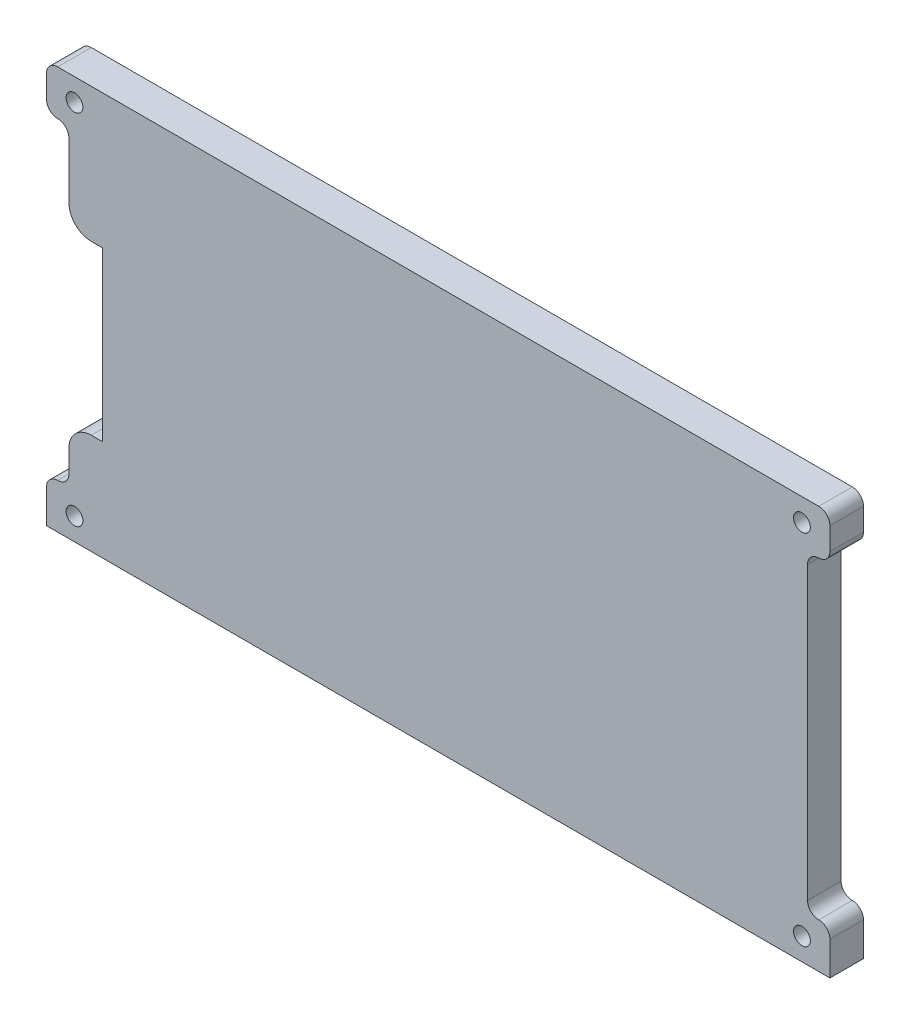
ISO-10303-21;
HEADER;
FILE_DESCRIPTION(('STEP AP214'),'2;1');
FILE_NAME('part.step','',(''),(''),'','','');
FILE_SCHEMA(('AUTOMOTIVE_DESIGN { 1 0 10303 214 1 1 1 1 }'));
ENDSEC;
DATA;
#1=APPLICATION_CONTEXT('core data for automotive mechanical design processes');
#2=APPLICATION_PROTOCOL_DEFINITION('international standard','automotive_design',2000,#1);
#3=PRODUCT_CONTEXT('',#1,'mechanical');
#4=PRODUCT('Part','Part','',(#3));
#5=PRODUCT_RELATED_PRODUCT_CATEGORY('part','',(#4));
#6=PRODUCT_DEFINITION_FORMATION('','',#4);
#7=PRODUCT_DEFINITION_CONTEXT('part definition',#1,'design');
#8=PRODUCT_DEFINITION('design','',#6,#7);
#9=PRODUCT_DEFINITION_SHAPE('','',#8);
#10=(LENGTH_UNIT() NAMED_UNIT(*) SI_UNIT(.MILLI.,.METRE.));
#11=(NAMED_UNIT(*) PLANE_ANGLE_UNIT() SI_UNIT($,.RADIAN.));
#12=(NAMED_UNIT(*) SI_UNIT($,.STERADIAN.) SOLID_ANGLE_UNIT());
#13=UNCERTAINTY_MEASURE_WITH_UNIT(LENGTH_MEASURE(1.E-05),#10,'distance_accuracy_value','');
#14=(GEOMETRIC_REPRESENTATION_CONTEXT(3) GLOBAL_UNCERTAINTY_ASSIGNED_CONTEXT((#13)) GLOBAL_UNIT_ASSIGNED_CONTEXT((#10,
#11,#12)) REPRESENTATION_CONTEXT('',''));
#15=CARTESIAN_POINT('',(0.,0.,0.));
#16=DIRECTION('',(0.,0.,1.));
#17=DIRECTION('',(1.,0.,0.));
#18=AXIS2_PLACEMENT_3D('',#15,#16,#17);
#19=CARTESIAN_POINT('',(-33.,-18.,3.));
#20=DIRECTION('',(1.,0.,0.));
#21=DIRECTION('',(0.,0.,-1.));
#22=AXIS2_PLACEMENT_3D('',#19,#20,#21);
#23=PLANE('',#22);
#24=DIRECTION('',(0.,-1.,0.));
#25=VECTOR('',#24,1.);
#26=CARTESIAN_POINT('',(-33.,-18.,3.));
#27=LINE('',#26,#25);
#28=CARTESIAN_POINT('',(-33.,13.,3.));
#29=VERTEX_POINT('',#28);
#30=CARTESIAN_POINT('',(-33.,8.,3.));
#31=VERTEX_POINT('',#30);
#32=EDGE_CURVE('E328',#29,#31,#27,.T.);
#33=ORIENTED_EDGE('',*,*,#32,.F.);
#34=DIRECTION('',(0.,0.,1.));
#35=VECTOR('',#34,1.);
#36=CARTESIAN_POINT('',(-33.,13.,3.));
#37=LINE('',#36,#35);
#38=CARTESIAN_POINT('',(-33.,13.,0.));
#39=VERTEX_POINT('',#38);
#40=EDGE_CURVE('E439',#29,#39,#37,.F.);
#41=ORIENTED_EDGE('',*,*,#40,.T.);
#42=DIRECTION('',(0.,-1.,0.));
#43=VECTOR('',#42,1.);
#44=CARTESIAN_POINT('',(-33.,-18.,0.));
#45=LINE('',#44,#43);
#46=CARTESIAN_POINT('',(-33.,8.,0.));
#47=VERTEX_POINT('',#46);
#48=EDGE_CURVE('E343',#39,#47,#45,.T.);
#49=ORIENTED_EDGE('',*,*,#48,.T.);
#50=DIRECTION('',(0.,0.,1.));
#51=VECTOR('',#50,1.);
#52=CARTESIAN_POINT('',(-33.,8.,3.));
#53=LINE('',#52,#51);
#54=EDGE_CURVE('E334',#47,#31,#53,.T.);
#55=ORIENTED_EDGE('',*,*,#54,.T.);
#56=EDGE_LOOP('',(#33,#41,#49,#55));
#57=FACE_BOUND('',#56,.T.);
#58=ADVANCED_FACE('F39',(#57),#23,.F.);
#59=CARTESIAN_POINT('',(-33.,-11.,0.));
#60=VERTEX_POINT('',#59);
#61=CARTESIAN_POINT('',(-33.,-13.,0.));
#62=VERTEX_POINT('',#61);
#63=EDGE_CURVE('E342',#60,#62,#45,.T.);
#64=ORIENTED_EDGE('',*,*,#63,.T.);
#65=DIRECTION('',(0.,0.,1.));
#66=VECTOR('',#65,1.);
#67=CARTESIAN_POINT('',(-33.,-13.,3.));
#68=LINE('',#67,#66);
#69=CARTESIAN_POINT('',(-33.,-13.,3.));
#70=VERTEX_POINT('',#69);
#71=EDGE_CURVE('E442',#62,#70,#68,.T.);
#72=ORIENTED_EDGE('',*,*,#71,.T.);
#73=CARTESIAN_POINT('',(-33.,-11.,3.));
#74=VERTEX_POINT('',#73);
#75=EDGE_CURVE('E327',#74,#70,#27,.T.);
#76=ORIENTED_EDGE('',*,*,#75,.F.);
#77=DIRECTION('',(0.,0.,1.));
#78=VECTOR('',#77,1.);
#79=CARTESIAN_POINT('',(-33.,-11.,3.));
#80=LINE('',#79,#78);
#81=EDGE_CURVE('E369',#74,#60,#80,.F.);
#82=ORIENTED_EDGE('',*,*,#81,.T.);
#83=EDGE_LOOP('',(#64,#72,#76,#82));
#84=FACE_BOUND('',#83,.T.);
#85=ADVANCED_FACE('F574',(#84),#23,.F.);
#86=CARTESIAN_POINT('',(33.,-18.,3.));
#87=DIRECTION('',(-1.,0.,0.));
#88=DIRECTION('',(0.,0.,1.));
#89=AXIS2_PLACEMENT_3D('',#86,#87,#88);
#90=PLANE('',#89);
#91=DIRECTION('',(0.,1.,0.));
#92=VECTOR('',#91,1.);
#93=CARTESIAN_POINT('',(33.,-18.,3.));
#94=LINE('',#93,#92);
#95=CARTESIAN_POINT('',(33.,-13.,3.));
#96=VERTEX_POINT('',#95);
#97=CARTESIAN_POINT('',(33.,13.,3.));
#98=VERTEX_POINT('',#97);
#99=EDGE_CURVE('E318',#96,#98,#94,.T.);
#100=ORIENTED_EDGE('',*,*,#99,.F.);
#101=DIRECTION('',(0.,0.,1.));
#102=VECTOR('',#101,1.);
#103=CARTESIAN_POINT('',(33.,-13.,3.));
#104=LINE('',#103,#102);
#105=CARTESIAN_POINT('',(33.,-13.,0.));
#106=VERTEX_POINT('',#105);
#107=EDGE_CURVE('E415',#96,#106,#104,.F.);
#108=ORIENTED_EDGE('',*,*,#107,.T.);
#109=DIRECTION('',(0.,1.,0.));
#110=VECTOR('',#109,1.);
#111=CARTESIAN_POINT('',(33.,-18.,0.));
#112=LINE('',#111,#110);
#113=CARTESIAN_POINT('',(33.,13.,0.));
#114=VERTEX_POINT('',#113);
#115=EDGE_CURVE('E314',#106,#114,#112,.T.);
#116=ORIENTED_EDGE('',*,*,#115,.T.);
#117=DIRECTION('',(0.,0.,1.));
#118=VECTOR('',#117,1.);
#119=CARTESIAN_POINT('',(33.,13.,3.));
#120=LINE('',#119,#118);
#121=EDGE_CURVE('E411',#114,#98,#120,.T.);
#122=ORIENTED_EDGE('',*,*,#121,.T.);
#123=EDGE_LOOP('',(#100,#108,#116,#122));
#124=FACE_BOUND('',#123,.T.);
#125=ADVANCED_FACE('F517',(#124),#90,.F.);
#126=CARTESIAN_POINT('',(-33.,18.,3.));
#127=DIRECTION('',(0.,-1.,0.));
#128=DIRECTION('',(0.,0.,-1.));
#129=AXIS2_PLACEMENT_3D('',#126,#127,#128);
#130=PLANE('',#129);
#131=DIRECTION('',(-1.,0.,0.));
#132=VECTOR('',#131,1.);
#133=CARTESIAN_POINT('',(-33.,18.,3.));
#134=LINE('',#133,#132);
#135=CARTESIAN_POINT('',(34.,18.,3.));
#136=VERTEX_POINT('',#135);
#137=CARTESIAN_POINT('',(-34.,18.,3.));
#138=VERTEX_POINT('',#137);
#139=EDGE_CURVE('E322',#136,#138,#134,.T.);
#140=ORIENTED_EDGE('',*,*,#139,.F.);
#141=DIRECTION('',(0.,0.,1.));
#142=VECTOR('',#141,1.);
#143=CARTESIAN_POINT('',(34.,18.,0.));
#144=LINE('',#143,#142);
#145=CARTESIAN_POINT('',(34.,18.,0.));
#146=VERTEX_POINT('',#145);
#147=EDGE_CURVE('E429',#136,#146,#144,.F.);
#148=ORIENTED_EDGE('',*,*,#147,.T.);
#149=DIRECTION('',(-1.,0.,0.));
#150=VECTOR('',#149,1.);
#151=CARTESIAN_POINT('',(-33.,18.,0.));
#152=LINE('',#151,#150);
#153=CARTESIAN_POINT('',(-34.,18.,0.));
#154=VERTEX_POINT('',#153);
#155=EDGE_CURVE('E338',#146,#154,#152,.T.);
#156=ORIENTED_EDGE('',*,*,#155,.T.);
#157=DIRECTION('',(0.,0.,1.));
#158=VECTOR('',#157,1.);
#159=CARTESIAN_POINT('',(-34.,18.,3.));
#160=LINE('',#159,#158);
#161=EDGE_CURVE('E425',#154,#138,#160,.T.);
#162=ORIENTED_EDGE('',*,*,#161,.T.);
#163=EDGE_LOOP('',(#140,#148,#156,#162));
#164=FACE_BOUND('',#163,.T.);
#165=ADVANCED_FACE('F540',(#164),#130,.F.);
#166=CARTESIAN_POINT('',(-33.,-18.,3.));
#167=DIRECTION('',(0.,1.,0.));
#168=DIRECTION('',(0.,0.,1.));
#169=AXIS2_PLACEMENT_3D('',#166,#167,#168);
#170=PLANE('',#169);
#171=DIRECTION('',(1.,0.,0.));
#172=VECTOR('',#171,1.);
#173=CARTESIAN_POINT('',(-33.,-18.,0.));
#174=LINE('',#173,#172);
#175=CARTESIAN_POINT('',(-35.,-18.,0.));
#176=VERTEX_POINT('',#175);
#177=CARTESIAN_POINT('',(35.,-18.,0.));
#178=VERTEX_POINT('',#177);
#179=EDGE_CURVE('E323',#176,#178,#174,.T.);
#180=ORIENTED_EDGE('',*,*,#179,.T.);
#181=DIRECTION('',(0.,0.,1.));
#182=VECTOR('',#181,1.);
#183=CARTESIAN_POINT('',(35.,-18.,0.));
#184=LINE('',#183,#182);
#185=CARTESIAN_POINT('',(35.,-18.,3.));
#186=VERTEX_POINT('',#185);
#187=EDGE_CURVE('E284',#178,#186,#184,.T.);
#188=ORIENTED_EDGE('',*,*,#187,.T.);
#189=DIRECTION('',(1.,0.,0.));
#190=VECTOR('',#189,1.);
#191=CARTESIAN_POINT('',(-33.,-18.,3.));
#192=LINE('',#191,#190);
#193=CARTESIAN_POINT('',(-35.,-18.,3.));
#194=VERTEX_POINT('',#193);
#195=EDGE_CURVE('E331',#194,#186,#192,.T.);
#196=ORIENTED_EDGE('',*,*,#195,.F.);
#197=DIRECTION('',(0.,0.,1.));
#198=VECTOR('',#197,1.);
#199=CARTESIAN_POINT('',(-35.,-18.,0.));
#200=LINE('',#199,#198);
#201=EDGE_CURVE('E303',#176,#194,#200,.T.);
#202=ORIENTED_EDGE('',*,*,#201,.F.);
#203=EDGE_LOOP('',(#180,#188,#196,#202));
#204=FACE_BOUND('',#203,.T.);
#205=ADVANCED_FACE('F499',(#204),#170,.F.);
#206=CARTESIAN_POINT('',(0.,0.,3.));
#207=DIRECTION('',(0.,0.,-1.));
#208=DIRECTION('',(-1.,0.,0.));
#209=AXIS2_PLACEMENT_3D('',#206,#207,#208);
#210=PLANE('',#209);
#211=CARTESIAN_POINT('',(32.5,16.,3.));
#212=DIRECTION('',(0.,0.,1.));
#213=DIRECTION('',(-1.,0.,0.));
#214=AXIS2_PLACEMENT_3D('',#211,#212,#213);
#215=CIRCLE('',#214,0.749999999999999);
#216=CARTESIAN_POINT('',(31.75,16.,3.));
#217=VERTEX_POINT('',#216);
#218=EDGE_CURVE('E215',#217,#217,#215,.T.);
#219=ORIENTED_EDGE('',*,*,#218,.F.);
#220=EDGE_LOOP('',(#219));
#221=FACE_BOUND('',#220,.T.);
#222=CARTESIAN_POINT('',(32.5,-16.,3.));
#223=DIRECTION('',(0.,0.,1.));
#224=DIRECTION('',(1.,0.,0.));
#225=AXIS2_PLACEMENT_3D('',#222,#223,#224);
#226=CIRCLE('',#225,0.749999999999999);
#227=CARTESIAN_POINT('',(33.25,-16.,3.));
#228=VERTEX_POINT('',#227);
#229=EDGE_CURVE('E261',#228,#228,#226,.T.);
#230=ORIENTED_EDGE('',*,*,#229,.F.);
#231=EDGE_LOOP('',(#230));
#232=FACE_BOUND('',#231,.T.);
#233=CARTESIAN_POINT('',(-32.5,-16.,3.));
#234=DIRECTION('',(0.,0.,1.));
#235=DIRECTION('',(-1.,0.,0.));
#236=AXIS2_PLACEMENT_3D('',#233,#234,#235);
#237=CIRCLE('',#236,0.749999999999999);
#238=CARTESIAN_POINT('',(-33.25,-16.,3.));
#239=VERTEX_POINT('',#238);
#240=EDGE_CURVE('E253',#239,#239,#237,.T.);
#241=ORIENTED_EDGE('',*,*,#240,.F.);
#242=EDGE_LOOP('',(#241));
#243=FACE_BOUND('',#242,.T.);
#244=CARTESIAN_POINT('',(-32.5,16.,3.));
#245=DIRECTION('',(0.,0.,1.));
#246=DIRECTION('',(1.,0.,0.));
#247=AXIS2_PLACEMENT_3D('',#244,#245,#246);
#248=CIRCLE('',#247,0.749999999999999);
#249=CARTESIAN_POINT('',(-31.75,16.,3.));
#250=VERTEX_POINT('',#249);
#251=EDGE_CURVE('E252',#250,#250,#248,.T.);
#252=ORIENTED_EDGE('',*,*,#251,.F.);
#253=EDGE_LOOP('',(#252));
#254=FACE_BOUND('',#253,.T.);
#255=DIRECTION('',(0.,1.,0.));
#256=VECTOR('',#255,1.);
#257=CARTESIAN_POINT('',(35.,-18.,3.));
#258=LINE('',#257,#256);
#259=CARTESIAN_POINT('',(35.,-15.,3.));
#260=VERTEX_POINT('',#259);
#261=EDGE_CURVE('E276',#186,#260,#258,.T.);
#262=ORIENTED_EDGE('',*,*,#261,.T.);
#263=CARTESIAN_POINT('',(34.,-15.,3.));
#264=DIRECTION('',(0.,0.,-1.));
#265=DIRECTION('',(-1.,0.,0.));
#266=AXIS2_PLACEMENT_3D('',#263,#264,#265);
#267=CIRCLE('',#266,1.);
#268=CARTESIAN_POINT('',(34.,-14.,3.));
#269=VERTEX_POINT('',#268);
#270=EDGE_CURVE('E391',#260,#269,#267,.F.);
#271=ORIENTED_EDGE('',*,*,#270,.T.);
#272=CARTESIAN_POINT('',(34.,-13.,3.));
#273=DIRECTION('',(0.,0.,-1.));
#274=DIRECTION('',(-1.,0.,0.));
#275=AXIS2_PLACEMENT_3D('',#272,#273,#274);
#276=CIRCLE('',#275,1.);
#277=EDGE_CURVE('E449',#269,#96,#276,.T.);
#278=ORIENTED_EDGE('',*,*,#277,.T.);
#279=ORIENTED_EDGE('',*,*,#99,.T.);
#280=CARTESIAN_POINT('',(34.,13.,3.));
#281=DIRECTION('',(0.,0.,-1.));
#282=DIRECTION('',(-1.,0.,0.));
#283=AXIS2_PLACEMENT_3D('',#280,#281,#282);
#284=CIRCLE('',#283,1.);
#285=CARTESIAN_POINT('',(34.,14.,3.));
#286=VERTEX_POINT('',#285);
#287=EDGE_CURVE('E455',#98,#286,#284,.T.);
#288=ORIENTED_EDGE('',*,*,#287,.T.);
#289=CARTESIAN_POINT('',(34.,15.,3.));
#290=DIRECTION('',(0.,0.,-1.));
#291=DIRECTION('',(-1.,0.,0.));
#292=AXIS2_PLACEMENT_3D('',#289,#290,#291);
#293=CIRCLE('',#292,1.);
#294=CARTESIAN_POINT('',(35.,15.,3.));
#295=VERTEX_POINT('',#294);
#296=EDGE_CURVE('E388',#286,#295,#293,.F.);
#297=ORIENTED_EDGE('',*,*,#296,.T.);
#298=DIRECTION('',(0.,1.,0.));
#299=VECTOR('',#298,1.);
#300=CARTESIAN_POINT('',(35.,18.,3.));
#301=LINE('',#300,#299);
#302=CARTESIAN_POINT('',(35.,17.,3.));
#303=VERTEX_POINT('',#302);
#304=EDGE_CURVE('E291',#295,#303,#301,.T.);
#305=ORIENTED_EDGE('',*,*,#304,.T.);
#306=CARTESIAN_POINT('',(34.,17.,3.));
#307=DIRECTION('',(0.,0.,-1.));
#308=DIRECTION('',(-1.,0.,0.));
#309=AXIS2_PLACEMENT_3D('',#306,#307,#308);
#310=CIRCLE('',#309,1.);
#311=EDGE_CURVE('E385',#303,#136,#310,.F.);
#312=ORIENTED_EDGE('',*,*,#311,.T.);
#313=ORIENTED_EDGE('',*,*,#139,.T.);
#314=CARTESIAN_POINT('',(-34.,17.,3.));
#315=DIRECTION('',(0.,0.,-1.));
#316=DIRECTION('',(-1.,0.,0.));
#317=AXIS2_PLACEMENT_3D('',#314,#315,#316);
#318=CIRCLE('',#317,1.);
#319=CARTESIAN_POINT('',(-35.,17.,3.));
#320=VERTEX_POINT('',#319);
#321=EDGE_CURVE('E382',#138,#320,#318,.F.);
#322=ORIENTED_EDGE('',*,*,#321,.T.);
#323=DIRECTION('',(0.,-1.,0.));
#324=VECTOR('',#323,1.);
#325=CARTESIAN_POINT('',(-35.,18.,3.));
#326=LINE('',#325,#324);
#327=CARTESIAN_POINT('',(-35.,15.,3.));
#328=VERTEX_POINT('',#327);
#329=EDGE_CURVE('E309',#320,#328,#326,.T.);
#330=ORIENTED_EDGE('',*,*,#329,.T.);
#331=CARTESIAN_POINT('',(-34.,15.,3.));
#332=DIRECTION('',(0.,0.,-1.));
#333=DIRECTION('',(-1.,0.,0.));
#334=AXIS2_PLACEMENT_3D('',#331,#332,#333);
#335=CIRCLE('',#334,1.);
#336=CARTESIAN_POINT('',(-34.,14.,3.));
#337=VERTEX_POINT('',#336);
#338=EDGE_CURVE('E379',#328,#337,#335,.F.);
#339=ORIENTED_EDGE('',*,*,#338,.T.);
#340=CARTESIAN_POINT('',(-34.,13.,3.));
#341=DIRECTION('',(0.,0.,-1.));
#342=DIRECTION('',(-1.,0.,0.));
#343=AXIS2_PLACEMENT_3D('',#340,#341,#342);
#344=CIRCLE('',#343,1.);
#345=EDGE_CURVE('E461',#337,#29,#344,.T.);
#346=ORIENTED_EDGE('',*,*,#345,.T.);
#347=ORIENTED_EDGE('',*,*,#32,.T.);
#348=CARTESIAN_POINT('',(-31.,8.,3.));
#349=DIRECTION('',(0.,0.,-1.));
#350=DIRECTION('',(-1.,0.,0.));
#351=AXIS2_PLACEMENT_3D('',#348,#349,#350);
#352=CIRCLE('',#351,2.);
#353=CARTESIAN_POINT('',(-31.,6.,3.));
#354=VERTEX_POINT('',#353);
#355=EDGE_CURVE('E354',#31,#354,#352,.F.);
#356=ORIENTED_EDGE('',*,*,#355,.T.);
#357=DIRECTION('',(-1.,0.,0.));
#358=VECTOR('',#357,1.);
#359=CARTESIAN_POINT('',(-33.,6.,3.));
#360=LINE('',#359,#358);
#361=CARTESIAN_POINT('',(-30.,6.,3.));
#362=VERTEX_POINT('',#361);
#363=EDGE_CURVE('E235',#362,#354,#360,.T.);
#364=ORIENTED_EDGE('',*,*,#363,.F.);
#365=DIRECTION('',(0.,1.,0.));
#366=VECTOR('',#365,1.);
#367=CARTESIAN_POINT('',(-30.,6.,3.));
#368=LINE('',#367,#366);
#369=CARTESIAN_POINT('',(-30.,-9.00000000000001,3.));
#370=VERTEX_POINT('',#369);
#371=EDGE_CURVE('E210',#370,#362,#368,.T.);
#372=ORIENTED_EDGE('',*,*,#371,.F.);
#373=DIRECTION('',(1.,0.,0.));
#374=VECTOR('',#373,1.);
#375=CARTESIAN_POINT('',(-33.,-9.00000000000001,3.));
#376=LINE('',#375,#374);
#377=CARTESIAN_POINT('',(-31.,-9.00000000000001,3.));
#378=VERTEX_POINT('',#377);
#379=EDGE_CURVE('E238',#378,#370,#376,.T.);
#380=ORIENTED_EDGE('',*,*,#379,.F.);
#381=CARTESIAN_POINT('',(-31.,-11.,3.));
#382=DIRECTION('',(0.,0.,-1.));
#383=DIRECTION('',(-1.,0.,0.));
#384=AXIS2_PLACEMENT_3D('',#381,#382,#383);
#385=CIRCLE('',#384,2.);
#386=EDGE_CURVE('E351',#378,#74,#385,.F.);
#387=ORIENTED_EDGE('',*,*,#386,.T.);
#388=ORIENTED_EDGE('',*,*,#75,.T.);
#389=CARTESIAN_POINT('',(-34.,-13.,3.));
#390=DIRECTION('',(0.,0.,-1.));
#391=DIRECTION('',(-1.,0.,0.));
#392=AXIS2_PLACEMENT_3D('',#389,#390,#391);
#393=CIRCLE('',#392,1.);
#394=CARTESIAN_POINT('',(-34.,-14.,3.));
#395=VERTEX_POINT('',#394);
#396=EDGE_CURVE('E49',#70,#395,#393,.T.);
#397=ORIENTED_EDGE('',*,*,#396,.T.);
#398=CARTESIAN_POINT('',(-34.,-15.,3.));
#399=DIRECTION('',(0.,0.,-1.));
#400=DIRECTION('',(-1.,0.,0.));
#401=AXIS2_PLACEMENT_3D('',#398,#399,#400);
#402=CIRCLE('',#401,1.);
#403=CARTESIAN_POINT('',(-35.,-15.,3.));
#404=VERTEX_POINT('',#403);
#405=EDGE_CURVE('E376',#395,#404,#402,.F.);
#406=ORIENTED_EDGE('',*,*,#405,.T.);
#407=DIRECTION('',(0.,-1.,0.));
#408=VECTOR('',#407,1.);
#409=CARTESIAN_POINT('',(-35.,-18.,3.));
#410=LINE('',#409,#408);
#411=EDGE_CURVE('E296',#404,#194,#410,.T.);
#412=ORIENTED_EDGE('',*,*,#411,.T.);
#413=ORIENTED_EDGE('',*,*,#195,.T.);
#414=EDGE_LOOP('',(#262,#271,#278,#279,#288,#297,#305,#312,#313,#322,#330,#339,#346,#347,#356,
#364,#372,#380,#387,#388,#397,#406,#412,#413));
#415=FACE_BOUND('',#414,.T.);
#416=ADVANCED_FACE('F491',(#221,#232,#243,#254,#415),#210,.F.);
#417=CARTESIAN_POINT('',(0.,0.,0.));
#418=DIRECTION('',(0.,0.,-1.));
#419=DIRECTION('',(-1.,0.,0.));
#420=AXIS2_PLACEMENT_3D('',#417,#418,#419);
#421=PLANE('',#420);
#422=ORIENTED_EDGE('',*,*,#115,.F.);
#423=CARTESIAN_POINT('',(34.,-13.,0.));
#424=DIRECTION('',(0.,0.,-1.));
#425=DIRECTION('',(-1.,0.,0.));
#426=AXIS2_PLACEMENT_3D('',#423,#424,#425);
#427=CIRCLE('',#426,1.);
#428=CARTESIAN_POINT('',(34.,-14.,0.));
#429=VERTEX_POINT('',#428);
#430=EDGE_CURVE('E452',#106,#429,#427,.F.);
#431=ORIENTED_EDGE('',*,*,#430,.T.);
#432=CARTESIAN_POINT('',(34.,-15.,0.));
#433=DIRECTION('',(0.,0.,-1.));
#434=DIRECTION('',(-1.,0.,0.));
#435=AXIS2_PLACEMENT_3D('',#432,#433,#434);
#436=CIRCLE('',#435,1.);
#437=CARTESIAN_POINT('',(35.,-15.,0.));
#438=VERTEX_POINT('',#437);
#439=EDGE_CURVE('E408',#429,#438,#436,.T.);
#440=ORIENTED_EDGE('',*,*,#439,.T.);
#441=DIRECTION('',(0.,1.,0.));
#442=VECTOR('',#441,1.);
#443=CARTESIAN_POINT('',(35.,-18.,0.));
#444=LINE('',#443,#442);
#445=EDGE_CURVE('E280',#178,#438,#444,.T.);
#446=ORIENTED_EDGE('',*,*,#445,.F.);
#447=ORIENTED_EDGE('',*,*,#179,.F.);
#448=DIRECTION('',(0.,-1.,0.));
#449=VECTOR('',#448,1.);
#450=CARTESIAN_POINT('',(-35.,-18.,0.));
#451=LINE('',#450,#449);
#452=CARTESIAN_POINT('',(-35.,-15.,0.));
#453=VERTEX_POINT('',#452);
#454=EDGE_CURVE('E300',#453,#176,#451,.T.);
#455=ORIENTED_EDGE('',*,*,#454,.F.);
#456=CARTESIAN_POINT('',(-34.,-15.,0.));
#457=DIRECTION('',(0.,0.,-1.));
#458=DIRECTION('',(-1.,0.,0.));
#459=AXIS2_PLACEMENT_3D('',#456,#457,#458);
#460=CIRCLE('',#459,1.);
#461=CARTESIAN_POINT('',(-34.,-14.,0.));
#462=VERTEX_POINT('',#461);
#463=EDGE_CURVE('E60',#453,#462,#460,.T.);
#464=ORIENTED_EDGE('',*,*,#463,.T.);
#465=CARTESIAN_POINT('',(-34.,-13.,0.));
#466=DIRECTION('',(0.,0.,-1.));
#467=DIRECTION('',(-1.,0.,0.));
#468=AXIS2_PLACEMENT_3D('',#465,#466,#467);
#469=CIRCLE('',#468,1.);
#470=EDGE_CURVE('E11',#462,#62,#469,.F.);
#471=ORIENTED_EDGE('',*,*,#470,.T.);
#472=ORIENTED_EDGE('',*,*,#63,.F.);
#473=CARTESIAN_POINT('',(-31.,-11.,0.));
#474=DIRECTION('',(0.,0.,-1.));
#475=DIRECTION('',(-1.,0.,0.));
#476=AXIS2_PLACEMENT_3D('',#473,#474,#475);
#477=CIRCLE('',#476,2.);
#478=CARTESIAN_POINT('',(-31.,-9.00000000000001,0.));
#479=VERTEX_POINT('',#478);
#480=EDGE_CURVE('E359',#60,#479,#477,.T.);
#481=ORIENTED_EDGE('',*,*,#480,.T.);
#482=DIRECTION('',(1.,0.,0.));
#483=VECTOR('',#482,1.);
#484=CARTESIAN_POINT('',(-33.,-9.00000000000001,0.));
#485=LINE('',#484,#483);
#486=CARTESIAN_POINT('',(-30.,-9.00000000000001,0.));
#487=VERTEX_POINT('',#486);
#488=EDGE_CURVE('E231',#479,#487,#485,.T.);
#489=ORIENTED_EDGE('',*,*,#488,.T.);
#490=DIRECTION('',(0.,1.,0.));
#491=VECTOR('',#490,1.);
#492=CARTESIAN_POINT('',(-30.,6.,0.));
#493=LINE('',#492,#491);
#494=CARTESIAN_POINT('',(-30.,6.,0.));
#495=VERTEX_POINT('',#494);
#496=EDGE_CURVE('E207',#487,#495,#493,.T.);
#497=ORIENTED_EDGE('',*,*,#496,.T.);
#498=DIRECTION('',(-1.,0.,0.));
#499=VECTOR('',#498,1.);
#500=CARTESIAN_POINT('',(-33.,6.,0.));
#501=LINE('',#500,#499);
#502=CARTESIAN_POINT('',(-31.,6.,0.));
#503=VERTEX_POINT('',#502);
#504=EDGE_CURVE('E219',#495,#503,#501,.T.);
#505=ORIENTED_EDGE('',*,*,#504,.T.);
#506=CARTESIAN_POINT('',(-31.,8.,0.));
#507=DIRECTION('',(0.,0.,-1.));
#508=DIRECTION('',(-1.,0.,0.));
#509=AXIS2_PLACEMENT_3D('',#506,#507,#508);
#510=CIRCLE('',#509,2.);
#511=EDGE_CURVE('E362',#503,#47,#510,.T.);
#512=ORIENTED_EDGE('',*,*,#511,.T.);
#513=ORIENTED_EDGE('',*,*,#48,.F.);
#514=CARTESIAN_POINT('',(-34.,13.,0.));
#515=DIRECTION('',(0.,0.,-1.));
#516=DIRECTION('',(-1.,0.,0.));
#517=AXIS2_PLACEMENT_3D('',#514,#515,#516);
#518=CIRCLE('',#517,1.);
#519=CARTESIAN_POINT('',(-34.,14.,0.));
#520=VERTEX_POINT('',#519);
#521=EDGE_CURVE('E464',#39,#520,#518,.F.);
#522=ORIENTED_EDGE('',*,*,#521,.T.);
#523=CARTESIAN_POINT('',(-34.,15.,0.));
#524=DIRECTION('',(0.,0.,-1.));
#525=DIRECTION('',(-1.,0.,0.));
#526=AXIS2_PLACEMENT_3D('',#523,#524,#525);
#527=CIRCLE('',#526,1.);
#528=CARTESIAN_POINT('',(-35.,15.,0.));
#529=VERTEX_POINT('',#528);
#530=EDGE_CURVE('E396',#520,#529,#527,.T.);
#531=ORIENTED_EDGE('',*,*,#530,.T.);
#532=DIRECTION('',(0.,-1.,0.));
#533=VECTOR('',#532,1.);
#534=CARTESIAN_POINT('',(-35.,18.,0.));
#535=LINE('',#534,#533);
#536=CARTESIAN_POINT('',(-35.,17.,0.));
#537=VERTEX_POINT('',#536);
#538=EDGE_CURVE('E310',#537,#529,#535,.T.);
#539=ORIENTED_EDGE('',*,*,#538,.F.);
#540=CARTESIAN_POINT('',(-34.,17.,0.));
#541=DIRECTION('',(0.,0.,-1.));
#542=DIRECTION('',(-1.,0.,0.));
#543=AXIS2_PLACEMENT_3D('',#540,#541,#542);
#544=CIRCLE('',#543,1.);
#545=EDGE_CURVE('E399',#537,#154,#544,.T.);
#546=ORIENTED_EDGE('',*,*,#545,.T.);
#547=ORIENTED_EDGE('',*,*,#155,.F.);
#548=CARTESIAN_POINT('',(34.,17.,0.));
#549=DIRECTION('',(0.,0.,-1.));
#550=DIRECTION('',(-1.,0.,0.));
#551=AXIS2_PLACEMENT_3D('',#548,#549,#550);
#552=CIRCLE('',#551,1.);
#553=CARTESIAN_POINT('',(35.,17.,0.));
#554=VERTEX_POINT('',#553);
#555=EDGE_CURVE('E402',#146,#554,#552,.T.);
#556=ORIENTED_EDGE('',*,*,#555,.T.);
#557=DIRECTION('',(0.,1.,0.));
#558=VECTOR('',#557,1.);
#559=CARTESIAN_POINT('',(35.,18.,0.));
#560=LINE('',#559,#558);
#561=CARTESIAN_POINT('',(35.,15.,0.));
#562=VERTEX_POINT('',#561);
#563=EDGE_CURVE('E292',#562,#554,#560,.T.);
#564=ORIENTED_EDGE('',*,*,#563,.F.);
#565=CARTESIAN_POINT('',(34.,15.,0.));
#566=DIRECTION('',(0.,0.,-1.));
#567=DIRECTION('',(-1.,0.,0.));
#568=AXIS2_PLACEMENT_3D('',#565,#566,#567);
#569=CIRCLE('',#568,1.);
#570=CARTESIAN_POINT('',(34.,14.,0.));
#571=VERTEX_POINT('',#570);
#572=EDGE_CURVE('E405',#562,#571,#569,.T.);
#573=ORIENTED_EDGE('',*,*,#572,.T.);
#574=CARTESIAN_POINT('',(34.,13.,0.));
#575=DIRECTION('',(0.,0.,-1.));
#576=DIRECTION('',(-1.,0.,0.));
#577=AXIS2_PLACEMENT_3D('',#574,#575,#576);
#578=CIRCLE('',#577,1.);
#579=EDGE_CURVE('E458',#571,#114,#578,.F.);
#580=ORIENTED_EDGE('',*,*,#579,.T.);
#581=EDGE_LOOP('',(#422,#431,#440,#446,#447,#455,#464,#471,#472,#481,#489,#497,#505,#512,#513,
#522,#531,#539,#546,#547,#556,#564,#573,#580));
#582=FACE_BOUND('',#581,.T.);
#583=CARTESIAN_POINT('',(32.5,16.,0.));
#584=DIRECTION('',(0.,0.,1.));
#585=DIRECTION('',(-1.,0.,0.));
#586=AXIS2_PLACEMENT_3D('',#583,#584,#585);
#587=CIRCLE('',#586,0.749999999999999);
#588=CARTESIAN_POINT('',(31.75,16.,0.));
#589=VERTEX_POINT('',#588);
#590=EDGE_CURVE('E265',#589,#589,#587,.T.);
#591=ORIENTED_EDGE('',*,*,#590,.T.);
#592=EDGE_LOOP('',(#591));
#593=FACE_BOUND('',#592,.T.);
#594=CARTESIAN_POINT('',(32.5,-16.,0.));
#595=DIRECTION('',(0.,0.,1.));
#596=DIRECTION('',(1.,0.,0.));
#597=AXIS2_PLACEMENT_3D('',#594,#595,#596);
#598=CIRCLE('',#597,0.749999999999999);
#599=CARTESIAN_POINT('',(33.25,-16.,0.));
#600=VERTEX_POINT('',#599);
#601=EDGE_CURVE('E257',#600,#600,#598,.T.);
#602=ORIENTED_EDGE('',*,*,#601,.T.);
#603=EDGE_LOOP('',(#602));
#604=FACE_BOUND('',#603,.T.);
#605=CARTESIAN_POINT('',(-32.5,-16.,0.));
#606=DIRECTION('',(0.,0.,1.));
#607=DIRECTION('',(-1.,0.,0.));
#608=AXIS2_PLACEMENT_3D('',#605,#606,#607);
#609=CIRCLE('',#608,0.749999999999999);
#610=CARTESIAN_POINT('',(-33.25,-16.,0.));
#611=VERTEX_POINT('',#610);
#612=EDGE_CURVE('E248',#611,#611,#609,.T.);
#613=ORIENTED_EDGE('',*,*,#612,.T.);
#614=EDGE_LOOP('',(#613));
#615=FACE_BOUND('',#614,.T.);
#616=CARTESIAN_POINT('',(-32.5,16.,0.));
#617=DIRECTION('',(0.,0.,1.));
#618=DIRECTION('',(1.,0.,0.));
#619=AXIS2_PLACEMENT_3D('',#616,#617,#618);
#620=CIRCLE('',#619,0.749999999999999);
#621=CARTESIAN_POINT('',(-31.75,16.,0.));
#622=VERTEX_POINT('',#621);
#623=EDGE_CURVE('E272',#622,#622,#620,.T.);
#624=ORIENTED_EDGE('',*,*,#623,.T.);
#625=EDGE_LOOP('',(#624));
#626=FACE_BOUND('',#625,.T.);
#627=ADVANCED_FACE('F228',(#582,#593,#604,#615,#626),#421,.T.);
#628=CARTESIAN_POINT('',(-35.,18.,0.));
#629=DIRECTION('',(-1.,0.,0.));
#630=DIRECTION('',(0.,0.,1.));
#631=AXIS2_PLACEMENT_3D('',#628,#629,#630);
#632=PLANE('',#631);
#633=ORIENTED_EDGE('',*,*,#329,.F.);
#634=DIRECTION('',(0.,0.,1.));
#635=VECTOR('',#634,1.);
#636=CARTESIAN_POINT('',(-35.,17.,0.));
#637=LINE('',#636,#635);
#638=EDGE_CURVE('E436',#320,#537,#637,.F.);
#639=ORIENTED_EDGE('',*,*,#638,.T.);
#640=ORIENTED_EDGE('',*,*,#538,.T.);
#641=DIRECTION('',(0.,0.,1.));
#642=VECTOR('',#641,1.);
#643=CARTESIAN_POINT('',(-35.,15.,0.));
#644=LINE('',#643,#642);
#645=EDGE_CURVE('E432',#529,#328,#644,.T.);
#646=ORIENTED_EDGE('',*,*,#645,.T.);
#647=EDGE_LOOP('',(#633,#639,#640,#646));
#648=FACE_BOUND('',#647,.T.);
#649=ADVANCED_FACE('F548',(#648),#632,.T.);
#650=CARTESIAN_POINT('',(-35.,-18.,0.));
#651=DIRECTION('',(-1.,0.,0.));
#652=DIRECTION('',(0.,0.,1.));
#653=AXIS2_PLACEMENT_3D('',#650,#651,#652);
#654=PLANE('',#653);
#655=ORIENTED_EDGE('',*,*,#411,.F.);
#656=DIRECTION('',(0.,0.,1.));
#657=VECTOR('',#656,1.);
#658=CARTESIAN_POINT('',(-35.,-15.,0.));
#659=LINE('',#658,#657);
#660=EDGE_CURVE('E446',#404,#453,#659,.F.);
#661=ORIENTED_EDGE('',*,*,#660,.T.);
#662=ORIENTED_EDGE('',*,*,#454,.T.);
#663=ORIENTED_EDGE('',*,*,#201,.T.);
#664=EDGE_LOOP('',(#655,#661,#662,#663));
#665=FACE_BOUND('',#664,.T.);
#666=ADVANCED_FACE('F495',(#665),#654,.T.);
#667=CARTESIAN_POINT('',(35.,18.,0.));
#668=DIRECTION('',(1.,0.,0.));
#669=DIRECTION('',(0.,0.,-1.));
#670=AXIS2_PLACEMENT_3D('',#667,#668,#669);
#671=PLANE('',#670);
#672=ORIENTED_EDGE('',*,*,#304,.F.);
#673=DIRECTION('',(0.,0.,1.));
#674=VECTOR('',#673,1.);
#675=CARTESIAN_POINT('',(35.,15.,0.));
#676=LINE('',#675,#674);
#677=EDGE_CURVE('E422',#295,#562,#676,.F.);
#678=ORIENTED_EDGE('',*,*,#677,.T.);
#679=ORIENTED_EDGE('',*,*,#563,.T.);
#680=DIRECTION('',(0.,0.,1.));
#681=VECTOR('',#680,1.);
#682=CARTESIAN_POINT('',(35.,17.,3.));
#683=LINE('',#682,#681);
#684=EDGE_CURVE('E418',#554,#303,#683,.T.);
#685=ORIENTED_EDGE('',*,*,#684,.T.);
#686=EDGE_LOOP('',(#672,#678,#679,#685));
#687=FACE_BOUND('',#686,.T.);
#688=ADVANCED_FACE('F531',(#687),#671,.T.);
#689=CARTESIAN_POINT('',(35.,-18.,0.));
#690=DIRECTION('',(1.,0.,0.));
#691=DIRECTION('',(0.,0.,-1.));
#692=AXIS2_PLACEMENT_3D('',#689,#690,#691);
#693=PLANE('',#692);
#694=ORIENTED_EDGE('',*,*,#445,.T.);
#695=DIRECTION('',(0.,0.,1.));
#696=VECTOR('',#695,1.);
#697=CARTESIAN_POINT('',(35.,-15.,0.));
#698=LINE('',#697,#696);
#699=EDGE_CURVE('E372',#438,#260,#698,.T.);
#700=ORIENTED_EDGE('',*,*,#699,.T.);
#701=ORIENTED_EDGE('',*,*,#261,.F.);
#702=ORIENTED_EDGE('',*,*,#187,.F.);
#703=EDGE_LOOP('',(#694,#700,#701,#702));
#704=FACE_BOUND('',#703,.T.);
#705=ADVANCED_FACE('F504',(#704),#693,.T.);
#706=CARTESIAN_POINT('',(-32.5,16.,0.));
#707=DIRECTION('',(0.,0.,1.));
#708=DIRECTION('',(1.,0.,0.));
#709=AXIS2_PLACEMENT_3D('',#706,#707,#708);
#710=CYLINDRICAL_SURFACE('',#709,0.749999999999999);
#711=ORIENTED_EDGE('',*,*,#623,.F.);
#712=EDGE_LOOP('',(#711));
#713=FACE_BOUND('',#712,.T.);
#714=ORIENTED_EDGE('',*,*,#251,.T.);
#715=EDGE_LOOP('',(#714));
#716=FACE_BOUND('',#715,.T.);
#717=ADVANCED_FACE('F697',(#713,#716),#710,.F.);
#718=CARTESIAN_POINT('',(-32.5,-16.,0.));
#719=DIRECTION('',(0.,0.,1.));
#720=DIRECTION('',(1.,0.,0.));
#721=AXIS2_PLACEMENT_3D('',#718,#719,#720);
#722=CYLINDRICAL_SURFACE('',#721,0.749999999999999);
#723=ORIENTED_EDGE('',*,*,#612,.F.);
#724=EDGE_LOOP('',(#723));
#725=FACE_BOUND('',#724,.T.);
#726=ORIENTED_EDGE('',*,*,#240,.T.);
#727=EDGE_LOOP('',(#726));
#728=FACE_BOUND('',#727,.T.);
#729=ADVANCED_FACE('F689',(#725,#728),#722,.F.);
#730=CARTESIAN_POINT('',(32.5,-16.,0.));
#731=DIRECTION('',(0.,0.,1.));
#732=DIRECTION('',(1.,0.,0.));
#733=AXIS2_PLACEMENT_3D('',#730,#731,#732);
#734=CYLINDRICAL_SURFACE('',#733,0.749999999999999);
#735=ORIENTED_EDGE('',*,*,#601,.F.);
#736=EDGE_LOOP('',(#735));
#737=FACE_BOUND('',#736,.T.);
#738=ORIENTED_EDGE('',*,*,#229,.T.);
#739=EDGE_LOOP('',(#738));
#740=FACE_BOUND('',#739,.T.);
#741=ADVANCED_FACE('F681',(#737,#740),#734,.F.);
#742=CARTESIAN_POINT('',(32.5,16.,0.));
#743=DIRECTION('',(0.,0.,1.));
#744=DIRECTION('',(1.,0.,0.));
#745=AXIS2_PLACEMENT_3D('',#742,#743,#744);
#746=CYLINDRICAL_SURFACE('',#745,0.749999999999999);
#747=ORIENTED_EDGE('',*,*,#590,.F.);
#748=EDGE_LOOP('',(#747));
#749=FACE_BOUND('',#748,.T.);
#750=ORIENTED_EDGE('',*,*,#218,.T.);
#751=EDGE_LOOP('',(#750));
#752=FACE_BOUND('',#751,.T.);
#753=ADVANCED_FACE('F675',(#749,#752),#746,.F.);
#754=CARTESIAN_POINT('',(-33.,6.,0.));
#755=DIRECTION('',(0.,1.,0.));
#756=DIRECTION('',(-1.,0.,0.));
#757=AXIS2_PLACEMENT_3D('',#754,#755,#756);
#758=PLANE('',#757);
#759=ORIENTED_EDGE('',*,*,#363,.T.);
#760=DIRECTION('',(0.,0.,1.));
#761=VECTOR('',#760,1.);
#762=CARTESIAN_POINT('',(-31.,6.,0.));
#763=LINE('',#762,#761);
#764=EDGE_CURVE('E222',#354,#503,#763,.F.);
#765=ORIENTED_EDGE('',*,*,#764,.T.);
#766=ORIENTED_EDGE('',*,*,#504,.F.);
#767=DIRECTION('',(0.,0.,1.));
#768=VECTOR('',#767,1.);
#769=CARTESIAN_POINT('',(-30.,6.,0.));
#770=LINE('',#769,#768);
#771=EDGE_CURVE('E202',#495,#362,#770,.T.);
#772=ORIENTED_EDGE('',*,*,#771,.T.);
#773=EDGE_LOOP('',(#759,#765,#766,#772));
#774=FACE_BOUND('',#773,.T.);
#775=ADVANCED_FACE('F220',(#774),#758,.F.);
#776=CARTESIAN_POINT('',(-30.,6.,0.));
#777=DIRECTION('',(1.,0.,0.));
#778=DIRECTION('',(0.,1.,0.));
#779=AXIS2_PLACEMENT_3D('',#776,#777,#778);
#780=PLANE('',#779);
#781=ORIENTED_EDGE('',*,*,#371,.T.);
#782=ORIENTED_EDGE('',*,*,#771,.F.);
#783=ORIENTED_EDGE('',*,*,#496,.F.);
#784=DIRECTION('',(0.,0.,1.));
#785=VECTOR('',#784,1.);
#786=CARTESIAN_POINT('',(-30.,-9.00000000000001,0.));
#787=LINE('',#786,#785);
#788=EDGE_CURVE('E216',#487,#370,#787,.T.);
#789=ORIENTED_EDGE('',*,*,#788,.T.);
#790=EDGE_LOOP('',(#781,#782,#783,#789));
#791=FACE_BOUND('',#790,.T.);
#792=ADVANCED_FACE('F204',(#791),#780,.F.);
#793=CARTESIAN_POINT('',(-33.,-9.00000000000001,0.));
#794=DIRECTION('',(0.,-1.,0.));
#795=DIRECTION('',(0.,0.,-1.));
#796=AXIS2_PLACEMENT_3D('',#793,#794,#795);
#797=PLANE('',#796);
#798=ORIENTED_EDGE('',*,*,#488,.F.);
#799=DIRECTION('',(0.,0.,1.));
#800=VECTOR('',#799,1.);
#801=CARTESIAN_POINT('',(-31.,-9.00000000000001,0.));
#802=LINE('',#801,#800);
#803=EDGE_CURVE('E365',#479,#378,#802,.T.);
#804=ORIENTED_EDGE('',*,*,#803,.T.);
#805=ORIENTED_EDGE('',*,*,#379,.T.);
#806=ORIENTED_EDGE('',*,*,#788,.F.);
#807=EDGE_LOOP('',(#798,#804,#805,#806));
#808=FACE_BOUND('',#807,.T.);
#809=ADVANCED_FACE('F567',(#808),#797,.F.);
#810=CARTESIAN_POINT('',(-31.,8.,3.));
#811=DIRECTION('',(0.,0.,1.));
#812=DIRECTION('',(1.,0.,0.));
#813=AXIS2_PLACEMENT_3D('',#810,#811,#812);
#814=CYLINDRICAL_SURFACE('',#813,2.);
#815=ORIENTED_EDGE('',*,*,#511,.F.);
#816=ORIENTED_EDGE('',*,*,#764,.F.);
#817=ORIENTED_EDGE('',*,*,#355,.F.);
#818=ORIENTED_EDGE('',*,*,#54,.F.);
#819=EDGE_LOOP('',(#815,#816,#817,#818));
#820=FACE_BOUND('',#819,.T.);
#821=ADVANCED_FACE('F563',(#820),#814,.T.);
#822=CARTESIAN_POINT('',(-31.,-11.,0.));
#823=DIRECTION('',(0.,0.,1.));
#824=DIRECTION('',(1.,0.,0.));
#825=AXIS2_PLACEMENT_3D('',#822,#823,#824);
#826=CYLINDRICAL_SURFACE('',#825,2.);
#827=ORIENTED_EDGE('',*,*,#480,.F.);
#828=ORIENTED_EDGE('',*,*,#81,.F.);
#829=ORIENTED_EDGE('',*,*,#386,.F.);
#830=ORIENTED_EDGE('',*,*,#803,.F.);
#831=EDGE_LOOP('',(#827,#828,#829,#830));
#832=FACE_BOUND('',#831,.T.);
#833=ADVANCED_FACE('F571',(#832),#826,.T.);
#834=CARTESIAN_POINT('',(34.,-13.,0.));
#835=DIRECTION('',(0.,0.,1.));
#836=DIRECTION('',(1.,0.,0.));
#837=AXIS2_PLACEMENT_3D('',#834,#835,#836);
#838=CYLINDRICAL_SURFACE('',#837,1.);
#839=DIRECTION('',(0.,0.,1.));
#840=VECTOR('',#839,1.);
#841=CARTESIAN_POINT('',(34.,-14.,0.));
#842=LINE('',#841,#840);
#843=EDGE_CURVE('E241',#429,#269,#842,.T.);
#844=ORIENTED_EDGE('',*,*,#843,.F.);
#845=ORIENTED_EDGE('',*,*,#430,.F.);
#846=ORIENTED_EDGE('',*,*,#107,.F.);
#847=ORIENTED_EDGE('',*,*,#277,.F.);
#848=EDGE_LOOP('',(#844,#845,#846,#847));
#849=FACE_BOUND('',#848,.T.);
#850=ADVANCED_FACE('F513',(#849),#838,.F.);
#851=CARTESIAN_POINT('',(34.,-15.,0.));
#852=DIRECTION('',(0.,0.,1.));
#853=DIRECTION('',(1.,0.,0.));
#854=AXIS2_PLACEMENT_3D('',#851,#852,#853);
#855=CYLINDRICAL_SURFACE('',#854,1.);
#856=ORIENTED_EDGE('',*,*,#439,.F.);
#857=ORIENTED_EDGE('',*,*,#843,.T.);
#858=ORIENTED_EDGE('',*,*,#270,.F.);
#859=ORIENTED_EDGE('',*,*,#699,.F.);
#860=EDGE_LOOP('',(#856,#857,#858,#859));
#861=FACE_BOUND('',#860,.T.);
#862=ADVANCED_FACE('F509',(#861),#855,.T.);
#863=CARTESIAN_POINT('',(34.,15.,0.));
#864=DIRECTION('',(0.,0.,1.));
#865=DIRECTION('',(1.,0.,0.));
#866=AXIS2_PLACEMENT_3D('',#863,#864,#865);
#867=CYLINDRICAL_SURFACE('',#866,1.);
#868=DIRECTION('',(0.,0.,1.));
#869=VECTOR('',#868,1.);
#870=CARTESIAN_POINT('',(34.,14.,0.));
#871=LINE('',#870,#869);
#872=EDGE_CURVE('E472',#571,#286,#871,.T.);
#873=ORIENTED_EDGE('',*,*,#872,.F.);
#874=ORIENTED_EDGE('',*,*,#572,.F.);
#875=ORIENTED_EDGE('',*,*,#677,.F.);
#876=ORIENTED_EDGE('',*,*,#296,.F.);
#877=EDGE_LOOP('',(#873,#874,#875,#876));
#878=FACE_BOUND('',#877,.T.);
#879=ADVANCED_FACE('F527',(#878),#867,.T.);
#880=CARTESIAN_POINT('',(34.,13.,3.));
#881=DIRECTION('',(0.,0.,1.));
#882=DIRECTION('',(1.,0.,0.));
#883=AXIS2_PLACEMENT_3D('',#880,#881,#882);
#884=CYLINDRICAL_SURFACE('',#883,1.);
#885=ORIENTED_EDGE('',*,*,#579,.F.);
#886=ORIENTED_EDGE('',*,*,#872,.T.);
#887=ORIENTED_EDGE('',*,*,#287,.F.);
#888=ORIENTED_EDGE('',*,*,#121,.F.);
#889=EDGE_LOOP('',(#885,#886,#887,#888));
#890=FACE_BOUND('',#889,.T.);
#891=ADVANCED_FACE('F521',(#890),#884,.F.);
#892=CARTESIAN_POINT('',(34.,17.,0.));
#893=DIRECTION('',(0.,0.,-1.));
#894=DIRECTION('',(-1.,0.,0.));
#895=AXIS2_PLACEMENT_3D('',#892,#893,#894);
#896=CYLINDRICAL_SURFACE('',#895,1.);
#897=ORIENTED_EDGE('',*,*,#555,.F.);
#898=ORIENTED_EDGE('',*,*,#147,.F.);
#899=ORIENTED_EDGE('',*,*,#311,.F.);
#900=ORIENTED_EDGE('',*,*,#684,.F.);
#901=EDGE_LOOP('',(#897,#898,#899,#900));
#902=FACE_BOUND('',#901,.T.);
#903=ADVANCED_FACE('F537',(#902),#896,.T.);
#904=CARTESIAN_POINT('',(-34.,17.,3.));
#905=DIRECTION('',(0.,0.,-1.));
#906=DIRECTION('',(-1.,0.,0.));
#907=AXIS2_PLACEMENT_3D('',#904,#905,#906);
#908=CYLINDRICAL_SURFACE('',#907,1.);
#909=ORIENTED_EDGE('',*,*,#545,.F.);
#910=ORIENTED_EDGE('',*,*,#638,.F.);
#911=ORIENTED_EDGE('',*,*,#321,.F.);
#912=ORIENTED_EDGE('',*,*,#161,.F.);
#913=EDGE_LOOP('',(#909,#910,#911,#912));
#914=FACE_BOUND('',#913,.T.);
#915=ADVANCED_FACE('F544',(#914),#908,.T.);
#916=CARTESIAN_POINT('',(-34.,13.,0.));
#917=DIRECTION('',(0.,0.,1.));
#918=DIRECTION('',(1.,0.,0.));
#919=AXIS2_PLACEMENT_3D('',#916,#917,#918);
#920=CYLINDRICAL_SURFACE('',#919,1.);
#921=DIRECTION('',(0.,0.,1.));
#922=VECTOR('',#921,1.);
#923=CARTESIAN_POINT('',(-34.,14.,0.));
#924=LINE('',#923,#922);
#925=EDGE_CURVE('E475',#520,#337,#924,.T.);
#926=ORIENTED_EDGE('',*,*,#925,.F.);
#927=ORIENTED_EDGE('',*,*,#521,.F.);
#928=ORIENTED_EDGE('',*,*,#40,.F.);
#929=ORIENTED_EDGE('',*,*,#345,.F.);
#930=EDGE_LOOP('',(#926,#927,#928,#929));
#931=FACE_BOUND('',#930,.T.);
#932=ADVANCED_FACE('F556',(#931),#920,.F.);
#933=CARTESIAN_POINT('',(-34.,15.,0.));
#934=DIRECTION('',(0.,0.,1.));
#935=DIRECTION('',(1.,0.,0.));
#936=AXIS2_PLACEMENT_3D('',#933,#934,#935);
#937=CYLINDRICAL_SURFACE('',#936,1.);
#938=ORIENTED_EDGE('',*,*,#530,.F.);
#939=ORIENTED_EDGE('',*,*,#925,.T.);
#940=ORIENTED_EDGE('',*,*,#338,.F.);
#941=ORIENTED_EDGE('',*,*,#645,.F.);
#942=EDGE_LOOP('',(#938,#939,#940,#941));
#943=FACE_BOUND('',#942,.T.);
#944=ADVANCED_FACE('F551',(#943),#937,.T.);
#945=CARTESIAN_POINT('',(-34.,-15.,0.));
#946=DIRECTION('',(0.,0.,1.));
#947=DIRECTION('',(1.,0.,0.));
#948=AXIS2_PLACEMENT_3D('',#945,#946,#947);
#949=CYLINDRICAL_SURFACE('',#948,1.);
#950=DIRECTION('',(0.,0.,1.));
#951=VECTOR('',#950,1.);
#952=CARTESIAN_POINT('',(-34.,-14.,0.));
#953=LINE('',#952,#951);
#954=EDGE_CURVE('E43',#462,#395,#953,.T.);
#955=ORIENTED_EDGE('',*,*,#954,.F.);
#956=ORIENTED_EDGE('',*,*,#463,.F.);
#957=ORIENTED_EDGE('',*,*,#660,.F.);
#958=ORIENTED_EDGE('',*,*,#405,.F.);
#959=EDGE_LOOP('',(#955,#956,#957,#958));
#960=FACE_BOUND('',#959,.T.);
#961=ADVANCED_FACE('F41',(#960),#949,.T.);
#962=CARTESIAN_POINT('',(-34.,-13.,3.));
#963=DIRECTION('',(0.,0.,1.));
#964=DIRECTION('',(1.,0.,0.));
#965=AXIS2_PLACEMENT_3D('',#962,#963,#964);
#966=CYLINDRICAL_SURFACE('',#965,1.);
#967=ORIENTED_EDGE('',*,*,#470,.F.);
#968=ORIENTED_EDGE('',*,*,#954,.T.);
#969=ORIENTED_EDGE('',*,*,#396,.F.);
#970=ORIENTED_EDGE('',*,*,#71,.F.);
#971=EDGE_LOOP('',(#967,#968,#969,#970));
#972=FACE_BOUND('',#971,.T.);
#973=ADVANCED_FACE('F484',(#972),#966,.F.);
#974=CLOSED_SHELL('',(#58,#85,#125,#165,#205,#416,#627,#649,#666,#688,#705,#717,#729,#741,#753,
#775,#792,#809,#821,#833,#850,#862,#879,#891,#903,#915,#932,#944,#961,#973));
#975=MANIFOLD_SOLID_BREP('B2',#974);
#976=ADVANCED_BREP_SHAPE_REPRESENTATION('',(#18,#975),#14);
#977=SHAPE_DEFINITION_REPRESENTATION(#9,#976);
ENDSEC;
END-ISO-10303-21;
